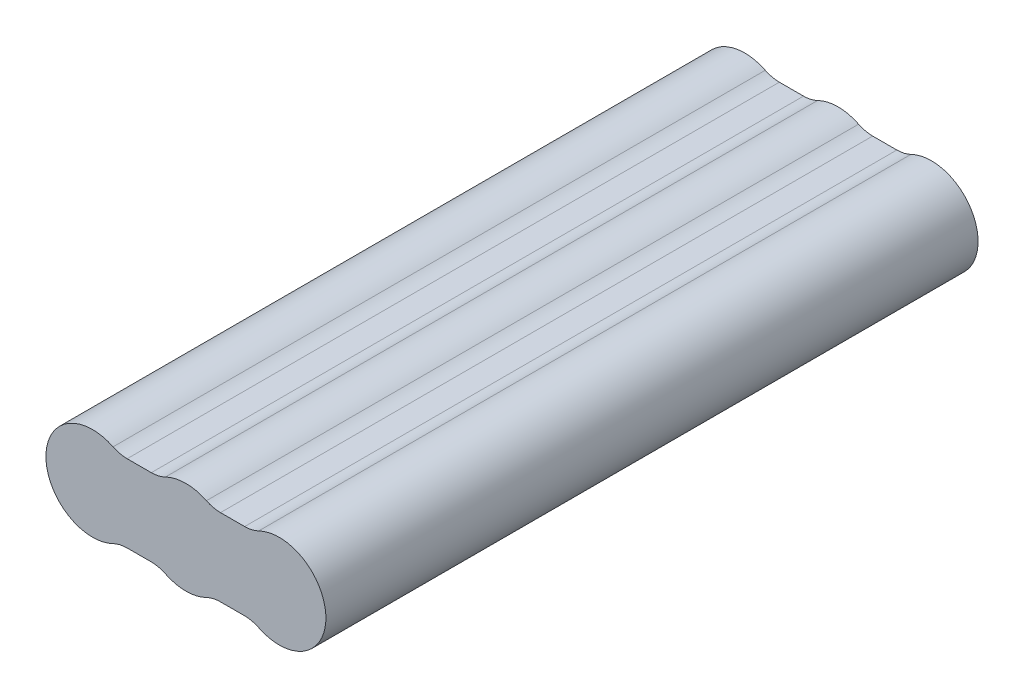
ISO-10303-21;
HEADER;
FILE_DESCRIPTION(('STEP AP214'),'2;1');
FILE_NAME('part.step','',(''),(''),'','','');
FILE_SCHEMA(('AUTOMOTIVE_DESIGN { 1 0 10303 214 1 1 1 1 }'));
ENDSEC;
DATA;
#1=APPLICATION_CONTEXT('core data for automotive mechanical design processes');
#2=APPLICATION_PROTOCOL_DEFINITION('international standard','automotive_design',2000,#1);
#3=PRODUCT_CONTEXT('',#1,'mechanical');
#4=PRODUCT('Part','Part','',(#3));
#5=PRODUCT_RELATED_PRODUCT_CATEGORY('part','',(#4));
#6=PRODUCT_DEFINITION_FORMATION('','',#4);
#7=PRODUCT_DEFINITION_CONTEXT('part definition',#1,'design');
#8=PRODUCT_DEFINITION('design','',#6,#7);
#9=PRODUCT_DEFINITION_SHAPE('','',#8);
#10=(LENGTH_UNIT() NAMED_UNIT(*) SI_UNIT(.MILLI.,.METRE.));
#11=(NAMED_UNIT(*) PLANE_ANGLE_UNIT() SI_UNIT($,.RADIAN.));
#12=(NAMED_UNIT(*) SI_UNIT($,.STERADIAN.) SOLID_ANGLE_UNIT());
#13=UNCERTAINTY_MEASURE_WITH_UNIT(LENGTH_MEASURE(1.E-05),#10,'distance_accuracy_value','');
#14=(GEOMETRIC_REPRESENTATION_CONTEXT(3) GLOBAL_UNCERTAINTY_ASSIGNED_CONTEXT((#13)) GLOBAL_UNIT_ASSIGNED_CONTEXT((#10,
#11,#12)) REPRESENTATION_CONTEXT('',''));
#15=CARTESIAN_POINT('',(0.,0.,0.));
#16=DIRECTION('',(0.,0.,1.));
#17=DIRECTION('',(1.,0.,0.));
#18=AXIS2_PLACEMENT_3D('',#15,#16,#17);
#19=CARTESIAN_POINT('',(3244.04460175756,2845.29621018992,129.3114));
#20=DIRECTION('',(0.,0.,-1.));
#21=DIRECTION('',(-1.,0.,0.));
#22=AXIS2_PLACEMENT_3D('',#19,#20,#21);
#23=CYLINDRICAL_SURFACE('',#22,6.35000000000014);
#24=CARTESIAN_POINT('',(3244.04460175756,2845.29621018992,0.));
#25=DIRECTION('',(0.,0.,-1.));
#26=DIRECTION('',(1.,0.,0.));
#27=AXIS2_PLACEMENT_3D('',#24,#25,#26);
#28=CIRCLE('',#27,6.35000000000014);
#29=CARTESIAN_POINT('',(3244.04460175756,2851.64621018992,0.));
#30=VERTEX_POINT('',#29);
#31=CARTESIAN_POINT('',(3246.83533190543,2851.00009704379,0.));
#32=VERTEX_POINT('',#31);
#33=EDGE_CURVE('E177',#30,#32,#28,.T.);
#34=ORIENTED_EDGE('',*,*,#33,.T.);
#35=DIRECTION('',(0.,0.,-1.));
#36=VECTOR('',#35,1.);
#37=CARTESIAN_POINT('',(3246.83533190543,2851.00009704379,129.3114));
#38=LINE('',#37,#36);
#39=CARTESIAN_POINT('',(3246.83533190543,2851.00009704379,129.3114));
#40=VERTEX_POINT('',#39);
#41=EDGE_CURVE('E11',#40,#32,#38,.T.);
#42=ORIENTED_EDGE('',*,*,#41,.F.);
#43=CARTESIAN_POINT('',(3244.04460175756,2845.29621018992,129.3114));
#44=DIRECTION('',(0.,0.,-1.));
#45=DIRECTION('',(1.,0.,0.));
#46=AXIS2_PLACEMENT_3D('',#43,#44,#45);
#47=CIRCLE('',#46,6.35000000000014);
#48=CARTESIAN_POINT('',(3244.04460175756,2851.64621018992,129.3114));
#49=VERTEX_POINT('',#48);
#50=EDGE_CURVE('E207',#49,#40,#47,.T.);
#51=ORIENTED_EDGE('',*,*,#50,.F.);
#52=DIRECTION('',(0.,0.,-1.));
#53=VECTOR('',#52,1.);
#54=CARTESIAN_POINT('',(3244.04460175756,2851.64621018992,129.3114));
#55=LINE('',#54,#53);
#56=EDGE_CURVE('E173',#49,#30,#55,.T.);
#57=ORIENTED_EDGE('',*,*,#56,.T.);
#58=EDGE_LOOP('',(#34,#42,#51,#57));
#59=FACE_BOUND('',#58,.T.);
#60=ADVANCED_FACE('F33',(#59),#23,.F.);
#61=CARTESIAN_POINT('',(3250.90142573087,2859.31066018989,129.3114));
#62=DIRECTION('',(0.,0.,-1.));
#63=DIRECTION('',(-1.,0.,0.));
#64=AXIS2_PLACEMENT_3D('',#61,#62,#63);
#65=CYLINDRICAL_SURFACE('',#64,9.2519500000007);
#66=CARTESIAN_POINT('',(3250.90142573087,2859.31066018989,0.));
#67=DIRECTION('',(0.,0.,1.));
#68=DIRECTION('',(1.,0.,0.));
#69=AXIS2_PLACEMENT_3D('',#66,#67,#68);
#70=CIRCLE('',#69,9.2519500000007);
#71=CARTESIAN_POINT('',(3246.83533190543,2867.62122333598,0.));
#72=VERTEX_POINT('',#71);
#73=EDGE_CURVE('E180',#32,#72,#70,.T.);
#74=ORIENTED_EDGE('',*,*,#73,.T.);
#75=DIRECTION('',(0.,0.,-1.));
#76=VECTOR('',#75,1.);
#77=CARTESIAN_POINT('',(3246.83533190543,2867.62122333598,129.3114));
#78=LINE('',#77,#76);
#79=CARTESIAN_POINT('',(3246.83533190543,2867.62122333598,129.3114));
#80=VERTEX_POINT('',#79);
#81=EDGE_CURVE('E41',#80,#72,#78,.T.);
#82=ORIENTED_EDGE('',*,*,#81,.F.);
#83=CARTESIAN_POINT('',(3250.90142573087,2859.31066018989,129.3114));
#84=DIRECTION('',(0.,0.,1.));
#85=DIRECTION('',(1.,0.,0.));
#86=AXIS2_PLACEMENT_3D('',#83,#84,#85);
#87=CIRCLE('',#86,9.2519500000007);
#88=EDGE_CURVE('E116',#40,#80,#87,.T.);
#89=ORIENTED_EDGE('',*,*,#88,.F.);
#90=ORIENTED_EDGE('',*,*,#41,.T.);
#91=EDGE_LOOP('',(#74,#82,#89,#90));
#92=FACE_BOUND('',#91,.T.);
#93=ADVANCED_FACE('F305',(#92),#65,.T.);
#94=CARTESIAN_POINT('',(3244.04460175756,2873.32511018985,129.3114));
#95=DIRECTION('',(0.,0.,-1.));
#96=DIRECTION('',(-1.,0.,0.));
#97=AXIS2_PLACEMENT_3D('',#94,#95,#96);
#98=CYLINDRICAL_SURFACE('',#97,6.35000000000034);
#99=CARTESIAN_POINT('',(3244.04460175756,2873.32511018985,0.));
#100=DIRECTION('',(0.,0.,-1.));
#101=DIRECTION('',(1.,0.,0.));
#102=AXIS2_PLACEMENT_3D('',#99,#100,#101);
#103=CIRCLE('',#102,6.35000000000034);
#104=CARTESIAN_POINT('',(3244.04460175756,2866.97511018985,0.));
#105=VERTEX_POINT('',#104);
#106=EDGE_CURVE('E182',#72,#105,#103,.T.);
#107=ORIENTED_EDGE('',*,*,#106,.T.);
#108=DIRECTION('',(0.,0.,-1.));
#109=VECTOR('',#108,1.);
#110=CARTESIAN_POINT('',(3244.04460175756,2866.97511018985,129.3114));
#111=LINE('',#110,#109);
#112=CARTESIAN_POINT('',(3244.04460175756,2866.97511018985,129.3114));
#113=VERTEX_POINT('',#112);
#114=EDGE_CURVE('E238',#113,#105,#111,.T.);
#115=ORIENTED_EDGE('',*,*,#114,.F.);
#116=CARTESIAN_POINT('',(3244.04460175756,2873.32511018985,129.3114));
#117=DIRECTION('',(0.,0.,-1.));
#118=DIRECTION('',(1.,0.,0.));
#119=AXIS2_PLACEMENT_3D('',#116,#117,#118);
#120=CIRCLE('',#119,6.35000000000034);
#121=EDGE_CURVE('E246',#80,#113,#120,.T.);
#122=ORIENTED_EDGE('',*,*,#121,.F.);
#123=ORIENTED_EDGE('',*,*,#81,.T.);
#124=EDGE_LOOP('',(#107,#115,#122,#123));
#125=FACE_BOUND('',#124,.T.);
#126=ADVANCED_FACE('F244',(#125),#98,.F.);
#127=CARTESIAN_POINT('',(3239.25434970419,2866.97511018985,129.3114));
#128=DIRECTION('',(0.,-1.,0.));
#129=DIRECTION('',(0.,0.,-1.));
#130=AXIS2_PLACEMENT_3D('',#127,#128,#129);
#131=PLANE('',#130);
#132=DIRECTION('',(-1.,0.,0.));
#133=VECTOR('',#132,1.);
#134=CARTESIAN_POINT('',(3239.25434970419,2866.97511018985,0.));
#135=LINE('',#134,#133);
#136=CARTESIAN_POINT('',(3239.25434970419,2866.97511018985,0.));
#137=VERTEX_POINT('',#136);
#138=EDGE_CURVE('E184',#105,#137,#135,.T.);
#139=ORIENTED_EDGE('',*,*,#138,.T.);
#140=DIRECTION('',(0.,0.,-1.));
#141=VECTOR('',#140,1.);
#142=CARTESIAN_POINT('',(3239.25434970419,2866.97511018985,129.3114));
#143=LINE('',#142,#141);
#144=CARTESIAN_POINT('',(3239.25434970419,2866.97511018985,129.3114));
#145=VERTEX_POINT('',#144);
#146=EDGE_CURVE('E235',#145,#137,#143,.T.);
#147=ORIENTED_EDGE('',*,*,#146,.F.);
#148=DIRECTION('',(-1.,0.,0.));
#149=VECTOR('',#148,1.);
#150=CARTESIAN_POINT('',(3239.25434970419,2866.97511018985,129.3114));
#151=LINE('',#150,#149);
#152=EDGE_CURVE('E264',#113,#145,#151,.T.);
#153=ORIENTED_EDGE('',*,*,#152,.F.);
#154=ORIENTED_EDGE('',*,*,#114,.T.);
#155=EDGE_LOOP('',(#139,#147,#153,#154));
#156=FACE_BOUND('',#155,.T.);
#157=ADVANCED_FACE('F255',(#156),#131,.F.);
#158=CARTESIAN_POINT('',(3239.25434970419,2873.32511018985,129.3114));
#159=DIRECTION('',(0.,0.,-1.));
#160=DIRECTION('',(-1.,0.,0.));
#161=AXIS2_PLACEMENT_3D('',#158,#159,#160);
#162=CYLINDRICAL_SURFACE('',#161,6.35000000000002);
#163=CARTESIAN_POINT('',(3239.25434970419,2873.32511018985,0.));
#164=DIRECTION('',(0.,0.,-1.));
#165=DIRECTION('',(1.,0.,0.));
#166=AXIS2_PLACEMENT_3D('',#163,#164,#165);
#167=CIRCLE('',#166,6.35000000000002);
#168=CARTESIAN_POINT('',(3236.46361955632,2867.62122333598,0.));
#169=VERTEX_POINT('',#168);
#170=EDGE_CURVE('E186',#137,#169,#167,.T.);
#171=ORIENTED_EDGE('',*,*,#170,.T.);
#172=DIRECTION('',(0.,0.,-1.));
#173=VECTOR('',#172,1.);
#174=CARTESIAN_POINT('',(3236.46361955632,2867.62122333598,129.3114));
#175=LINE('',#174,#173);
#176=CARTESIAN_POINT('',(3236.46361955632,2867.62122333598,129.3114));
#177=VERTEX_POINT('',#176);
#178=EDGE_CURVE('E232',#177,#169,#175,.T.);
#179=ORIENTED_EDGE('',*,*,#178,.F.);
#180=CARTESIAN_POINT('',(3239.25434970419,2873.32511018985,129.3114));
#181=DIRECTION('',(0.,0.,-1.));
#182=DIRECTION('',(1.,0.,0.));
#183=AXIS2_PLACEMENT_3D('',#180,#181,#182);
#184=CIRCLE('',#183,6.35000000000002);
#185=EDGE_CURVE('E261',#145,#177,#184,.T.);
#186=ORIENTED_EDGE('',*,*,#185,.F.);
#187=ORIENTED_EDGE('',*,*,#146,.T.);
#188=EDGE_LOOP('',(#171,#179,#186,#187));
#189=FACE_BOUND('',#188,.T.);
#190=ADVANCED_FACE('F259',(#189),#162,.F.);
#191=CARTESIAN_POINT('',(3232.39752573087,2859.31066018989,129.3114));
#192=DIRECTION('',(0.,0.,-1.));
#193=DIRECTION('',(-1.,0.,0.));
#194=AXIS2_PLACEMENT_3D('',#191,#192,#193);
#195=CYLINDRICAL_SURFACE('',#194,9.2519500000007);
#196=CARTESIAN_POINT('',(3232.39752573087,2859.31066018989,0.));
#197=DIRECTION('',(0.,0.,1.));
#198=DIRECTION('',(1.,0.,0.));
#199=AXIS2_PLACEMENT_3D('',#196,#197,#198);
#200=CIRCLE('',#199,9.2519500000007);
#201=CARTESIAN_POINT('',(3228.33143190543,2867.62122333598,0.));
#202=VERTEX_POINT('',#201);
#203=EDGE_CURVE('E188',#169,#202,#200,.T.);
#204=ORIENTED_EDGE('',*,*,#203,.T.);
#205=DIRECTION('',(0.,0.,-1.));
#206=VECTOR('',#205,1.);
#207=CARTESIAN_POINT('',(3228.33143190543,2867.62122333598,129.3114));
#208=LINE('',#207,#206);
#209=CARTESIAN_POINT('',(3228.33143190543,2867.62122333598,129.3114));
#210=VERTEX_POINT('',#209);
#211=EDGE_CURVE('E229',#210,#202,#208,.T.);
#212=ORIENTED_EDGE('',*,*,#211,.F.);
#213=CARTESIAN_POINT('',(3232.39752573087,2859.31066018989,129.3114));
#214=DIRECTION('',(0.,0.,1.));
#215=DIRECTION('',(1.,0.,0.));
#216=AXIS2_PLACEMENT_3D('',#213,#214,#215);
#217=CIRCLE('',#216,9.2519500000007);
#218=EDGE_CURVE('E263',#177,#210,#217,.T.);
#219=ORIENTED_EDGE('',*,*,#218,.F.);
#220=ORIENTED_EDGE('',*,*,#178,.T.);
#221=EDGE_LOOP('',(#204,#212,#219,#220));
#222=FACE_BOUND('',#221,.T.);
#223=ADVANCED_FACE('F318',(#222),#195,.T.);
#224=CARTESIAN_POINT('',(3225.54070175756,2873.32511018985,129.3114));
#225=DIRECTION('',(0.,0.,-1.));
#226=DIRECTION('',(-1.,0.,0.));
#227=AXIS2_PLACEMENT_3D('',#224,#225,#226);
#228=CYLINDRICAL_SURFACE('',#227,6.35000000000034);
#229=CARTESIAN_POINT('',(3225.54070175756,2873.32511018985,0.));
#230=DIRECTION('',(0.,0.,-1.));
#231=DIRECTION('',(1.,0.,0.));
#232=AXIS2_PLACEMENT_3D('',#229,#230,#231);
#233=CIRCLE('',#232,6.35000000000034);
#234=CARTESIAN_POINT('',(3225.54070175756,2866.97511018985,0.));
#235=VERTEX_POINT('',#234);
#236=EDGE_CURVE('E190',#202,#235,#233,.T.);
#237=ORIENTED_EDGE('',*,*,#236,.T.);
#238=DIRECTION('',(0.,0.,-1.));
#239=VECTOR('',#238,1.);
#240=CARTESIAN_POINT('',(3225.54070175756,2866.97511018985,129.3114));
#241=LINE('',#240,#239);
#242=CARTESIAN_POINT('',(3225.54070175756,2866.97511018985,129.3114));
#243=VERTEX_POINT('',#242);
#244=EDGE_CURVE('E226',#243,#235,#241,.T.);
#245=ORIENTED_EDGE('',*,*,#244,.F.);
#246=CARTESIAN_POINT('',(3225.54070175756,2873.32511018985,129.3114));
#247=DIRECTION('',(0.,0.,-1.));
#248=DIRECTION('',(1.,0.,0.));
#249=AXIS2_PLACEMENT_3D('',#246,#247,#248);
#250=CIRCLE('',#249,6.35000000000034);
#251=EDGE_CURVE('E266',#210,#243,#250,.T.);
#252=ORIENTED_EDGE('',*,*,#251,.F.);
#253=ORIENTED_EDGE('',*,*,#211,.T.);
#254=EDGE_LOOP('',(#237,#245,#252,#253));
#255=FACE_BOUND('',#254,.T.);
#256=ADVANCED_FACE('F321',(#255),#228,.F.);
#257=CARTESIAN_POINT('',(3220.75044970419,2866.97511018985,129.3114));
#258=DIRECTION('',(0.,-1.,0.));
#259=DIRECTION('',(0.,0.,-1.));
#260=AXIS2_PLACEMENT_3D('',#257,#258,#259);
#261=PLANE('',#260);
#262=DIRECTION('',(-1.,0.,0.));
#263=VECTOR('',#262,1.);
#264=CARTESIAN_POINT('',(3220.75044970419,2866.97511018985,0.));
#265=LINE('',#264,#263);
#266=CARTESIAN_POINT('',(3220.75044970419,2866.97511018985,0.));
#267=VERTEX_POINT('',#266);
#268=EDGE_CURVE('E192',#235,#267,#265,.T.);
#269=ORIENTED_EDGE('',*,*,#268,.T.);
#270=DIRECTION('',(0.,0.,-1.));
#271=VECTOR('',#270,1.);
#272=CARTESIAN_POINT('',(3220.75044970419,2866.97511018985,129.3114));
#273=LINE('',#272,#271);
#274=CARTESIAN_POINT('',(3220.75044970419,2866.97511018985,129.3114));
#275=VERTEX_POINT('',#274);
#276=EDGE_CURVE('E223',#275,#267,#273,.T.);
#277=ORIENTED_EDGE('',*,*,#276,.F.);
#278=DIRECTION('',(-1.,0.,0.));
#279=VECTOR('',#278,1.);
#280=CARTESIAN_POINT('',(3220.75044970419,2866.97511018985,129.3114));
#281=LINE('',#280,#279);
#282=EDGE_CURVE('E272',#243,#275,#281,.T.);
#283=ORIENTED_EDGE('',*,*,#282,.F.);
#284=ORIENTED_EDGE('',*,*,#244,.T.);
#285=EDGE_LOOP('',(#269,#277,#283,#284));
#286=FACE_BOUND('',#285,.T.);
#287=ADVANCED_FACE('F325',(#286),#261,.F.);
#288=CARTESIAN_POINT('',(3220.75044970419,2873.32511018985,129.3114));
#289=DIRECTION('',(0.,0.,-1.));
#290=DIRECTION('',(-1.,0.,0.));
#291=AXIS2_PLACEMENT_3D('',#288,#289,#290);
#292=CYLINDRICAL_SURFACE('',#291,6.35000000000002);
#293=CARTESIAN_POINT('',(3220.75044970419,2873.32511018985,0.));
#294=DIRECTION('',(0.,0.,-1.));
#295=DIRECTION('',(1.,0.,0.));
#296=AXIS2_PLACEMENT_3D('',#293,#294,#295);
#297=CIRCLE('',#296,6.35000000000002);
#298=CARTESIAN_POINT('',(3217.95971955632,2867.62122333598,0.));
#299=VERTEX_POINT('',#298);
#300=EDGE_CURVE('E194',#267,#299,#297,.T.);
#301=ORIENTED_EDGE('',*,*,#300,.T.);
#302=DIRECTION('',(0.,0.,-1.));
#303=VECTOR('',#302,1.);
#304=CARTESIAN_POINT('',(3217.95971955632,2867.62122333598,129.3114));
#305=LINE('',#304,#303);
#306=CARTESIAN_POINT('',(3217.95971955632,2867.62122333598,129.3114));
#307=VERTEX_POINT('',#306);
#308=EDGE_CURVE('E220',#307,#299,#305,.T.);
#309=ORIENTED_EDGE('',*,*,#308,.F.);
#310=CARTESIAN_POINT('',(3220.75044970419,2873.32511018985,129.3114));
#311=DIRECTION('',(0.,0.,-1.));
#312=DIRECTION('',(1.,0.,0.));
#313=AXIS2_PLACEMENT_3D('',#310,#311,#312);
#314=CIRCLE('',#313,6.35000000000002);
#315=EDGE_CURVE('E274',#275,#307,#314,.T.);
#316=ORIENTED_EDGE('',*,*,#315,.F.);
#317=ORIENTED_EDGE('',*,*,#276,.T.);
#318=EDGE_LOOP('',(#301,#309,#316,#317));
#319=FACE_BOUND('',#318,.T.);
#320=ADVANCED_FACE('F329',(#319),#292,.F.);
#321=CARTESIAN_POINT('',(3213.89362573087,2859.31066018989,129.3114));
#322=DIRECTION('',(0.,0.,-1.));
#323=DIRECTION('',(-1.,0.,0.));
#324=AXIS2_PLACEMENT_3D('',#321,#322,#323);
#325=CYLINDRICAL_SURFACE('',#324,9.2519500000003);
#326=CARTESIAN_POINT('',(3213.89362573087,2859.31066018989,0.));
#327=DIRECTION('',(0.,0.,1.));
#328=DIRECTION('',(1.,0.,0.));
#329=AXIS2_PLACEMENT_3D('',#326,#327,#328);
#330=CIRCLE('',#329,9.2519500000003);
#331=CARTESIAN_POINT('',(3217.95971955632,2851.00009704379,0.));
#332=VERTEX_POINT('',#331);
#333=EDGE_CURVE('E196',#299,#332,#330,.T.);
#334=ORIENTED_EDGE('',*,*,#333,.T.);
#335=DIRECTION('',(0.,0.,-1.));
#336=VECTOR('',#335,1.);
#337=CARTESIAN_POINT('',(3217.95971955632,2851.00009704379,129.3114));
#338=LINE('',#337,#336);
#339=CARTESIAN_POINT('',(3217.95971955632,2851.00009704379,129.3114));
#340=VERTEX_POINT('',#339);
#341=EDGE_CURVE('E217',#340,#332,#338,.T.);
#342=ORIENTED_EDGE('',*,*,#341,.F.);
#343=CARTESIAN_POINT('',(3213.89362573087,2859.31066018989,129.3114));
#344=DIRECTION('',(0.,0.,1.));
#345=DIRECTION('',(1.,0.,0.));
#346=AXIS2_PLACEMENT_3D('',#343,#344,#345);
#347=CIRCLE('',#346,9.2519500000003);
#348=EDGE_CURVE('E276',#307,#340,#347,.T.);
#349=ORIENTED_EDGE('',*,*,#348,.F.);
#350=ORIENTED_EDGE('',*,*,#308,.T.);
#351=EDGE_LOOP('',(#334,#342,#349,#350));
#352=FACE_BOUND('',#351,.T.);
#353=ADVANCED_FACE('F333',(#352),#325,.T.);
#354=CARTESIAN_POINT('',(3220.75044970419,2845.29621018992,129.3114));
#355=DIRECTION('',(0.,0.,-1.));
#356=DIRECTION('',(-1.,0.,0.));
#357=AXIS2_PLACEMENT_3D('',#354,#355,#356);
#358=CYLINDRICAL_SURFACE('',#357,6.35000000000002);
#359=CARTESIAN_POINT('',(3220.75044970419,2845.29621018992,0.));
#360=DIRECTION('',(0.,0.,-1.));
#361=DIRECTION('',(1.,0.,0.));
#362=AXIS2_PLACEMENT_3D('',#359,#360,#361);
#363=CIRCLE('',#362,6.35000000000002);
#364=CARTESIAN_POINT('',(3220.75044970419,2851.64621018992,0.));
#365=VERTEX_POINT('',#364);
#366=EDGE_CURVE('E198',#332,#365,#363,.T.);
#367=ORIENTED_EDGE('',*,*,#366,.T.);
#368=DIRECTION('',(0.,0.,-1.));
#369=VECTOR('',#368,1.);
#370=CARTESIAN_POINT('',(3220.75044970419,2851.64621018992,129.3114));
#371=LINE('',#370,#369);
#372=CARTESIAN_POINT('',(3220.75044970419,2851.64621018992,129.3114));
#373=VERTEX_POINT('',#372);
#374=EDGE_CURVE('E214',#373,#365,#371,.T.);
#375=ORIENTED_EDGE('',*,*,#374,.F.);
#376=CARTESIAN_POINT('',(3220.75044970419,2845.29621018992,129.3114));
#377=DIRECTION('',(0.,0.,-1.));
#378=DIRECTION('',(1.,0.,0.));
#379=AXIS2_PLACEMENT_3D('',#376,#377,#378);
#380=CIRCLE('',#379,6.35000000000002);
#381=EDGE_CURVE('E278',#340,#373,#380,.T.);
#382=ORIENTED_EDGE('',*,*,#381,.F.);
#383=ORIENTED_EDGE('',*,*,#341,.T.);
#384=EDGE_LOOP('',(#367,#375,#382,#383));
#385=FACE_BOUND('',#384,.T.);
#386=ADVANCED_FACE('F337',(#385),#358,.F.);
#387=CARTESIAN_POINT('',(3220.75044970419,2851.64621018992,129.3114));
#388=DIRECTION('',(0.,1.,0.));
#389=DIRECTION('',(0.,0.,1.));
#390=AXIS2_PLACEMENT_3D('',#387,#388,#389);
#391=PLANE('',#390);
#392=DIRECTION('',(1.,0.,0.));
#393=VECTOR('',#392,1.);
#394=CARTESIAN_POINT('',(3220.75044970419,2851.64621018992,0.));
#395=LINE('',#394,#393);
#396=CARTESIAN_POINT('',(3225.54070175756,2851.64621018992,0.));
#397=VERTEX_POINT('',#396);
#398=EDGE_CURVE('E200',#365,#397,#395,.T.);
#399=ORIENTED_EDGE('',*,*,#398,.T.);
#400=DIRECTION('',(0.,0.,-1.));
#401=VECTOR('',#400,1.);
#402=CARTESIAN_POINT('',(3225.54070175756,2851.64621018992,129.3114));
#403=LINE('',#402,#401);
#404=CARTESIAN_POINT('',(3225.54070175756,2851.64621018992,129.3114));
#405=VERTEX_POINT('',#404);
#406=EDGE_CURVE('E211',#405,#397,#403,.T.);
#407=ORIENTED_EDGE('',*,*,#406,.F.);
#408=DIRECTION('',(1.,0.,0.));
#409=VECTOR('',#408,1.);
#410=CARTESIAN_POINT('',(3220.75044970419,2851.64621018992,129.3114));
#411=LINE('',#410,#409);
#412=EDGE_CURVE('E280',#373,#405,#411,.T.);
#413=ORIENTED_EDGE('',*,*,#412,.F.);
#414=ORIENTED_EDGE('',*,*,#374,.T.);
#415=EDGE_LOOP('',(#399,#407,#413,#414));
#416=FACE_BOUND('',#415,.T.);
#417=ADVANCED_FACE('F286',(#416),#391,.F.);
#418=CARTESIAN_POINT('',(3225.54070175756,2845.29621018992,129.3114));
#419=DIRECTION('',(0.,0.,-1.));
#420=DIRECTION('',(-1.,0.,0.));
#421=AXIS2_PLACEMENT_3D('',#418,#419,#420);
#422=CYLINDRICAL_SURFACE('',#421,6.35000000000024);
#423=CARTESIAN_POINT('',(3225.54070175756,2845.29621018992,0.));
#424=DIRECTION('',(0.,0.,-1.));
#425=DIRECTION('',(1.,0.,0.));
#426=AXIS2_PLACEMENT_3D('',#423,#424,#425);
#427=CIRCLE('',#426,6.35000000000024);
#428=CARTESIAN_POINT('',(3228.33143190543,2851.00009704379,0.));
#429=VERTEX_POINT('',#428);
#430=EDGE_CURVE('E202',#397,#429,#427,.T.);
#431=ORIENTED_EDGE('',*,*,#430,.T.);
#432=DIRECTION('',(0.,0.,-1.));
#433=VECTOR('',#432,1.);
#434=CARTESIAN_POINT('',(3228.33143190543,2851.00009704379,129.3114));
#435=LINE('',#434,#433);
#436=CARTESIAN_POINT('',(3228.33143190543,2851.00009704379,129.3114));
#437=VERTEX_POINT('',#436);
#438=EDGE_CURVE('E168',#437,#429,#435,.T.);
#439=ORIENTED_EDGE('',*,*,#438,.F.);
#440=CARTESIAN_POINT('',(3225.54070175756,2845.29621018992,129.3114));
#441=DIRECTION('',(0.,0.,-1.));
#442=DIRECTION('',(1.,0.,0.));
#443=AXIS2_PLACEMENT_3D('',#440,#441,#442);
#444=CIRCLE('',#443,6.35000000000024);
#445=EDGE_CURVE('E159',#405,#437,#444,.T.);
#446=ORIENTED_EDGE('',*,*,#445,.F.);
#447=ORIENTED_EDGE('',*,*,#406,.T.);
#448=EDGE_LOOP('',(#431,#439,#446,#447));
#449=FACE_BOUND('',#448,.T.);
#450=ADVANCED_FACE('F290',(#449),#422,.F.);
#451=CARTESIAN_POINT('',(3232.39752573087,2859.31066018989,129.3114));
#452=DIRECTION('',(0.,0.,-1.));
#453=DIRECTION('',(-1.,0.,0.));
#454=AXIS2_PLACEMENT_3D('',#451,#452,#453);
#455=CYLINDRICAL_SURFACE('',#454,9.2519500000003);
#456=CARTESIAN_POINT('',(3232.39752573087,2859.31066018989,0.));
#457=DIRECTION('',(0.,0.,1.));
#458=DIRECTION('',(1.,0.,0.));
#459=AXIS2_PLACEMENT_3D('',#456,#457,#458);
#460=CIRCLE('',#459,9.2519500000003);
#461=CARTESIAN_POINT('',(3236.46361955632,2851.00009704379,0.));
#462=VERTEX_POINT('',#461);
#463=EDGE_CURVE('E167',#429,#462,#460,.T.);
#464=ORIENTED_EDGE('',*,*,#463,.T.);
#465=DIRECTION('',(0.,0.,-1.));
#466=VECTOR('',#465,1.);
#467=CARTESIAN_POINT('',(3236.46361955632,2851.00009704379,129.3114));
#468=LINE('',#467,#466);
#469=CARTESIAN_POINT('',(3236.46361955632,2851.00009704379,129.3114));
#470=VERTEX_POINT('',#469);
#471=EDGE_CURVE('E164',#470,#462,#468,.T.);
#472=ORIENTED_EDGE('',*,*,#471,.F.);
#473=CARTESIAN_POINT('',(3232.39752573087,2859.31066018989,129.3114));
#474=DIRECTION('',(0.,0.,1.));
#475=DIRECTION('',(1.,0.,0.));
#476=AXIS2_PLACEMENT_3D('',#473,#474,#475);
#477=CIRCLE('',#476,9.2519500000003);
#478=EDGE_CURVE('E153',#437,#470,#477,.T.);
#479=ORIENTED_EDGE('',*,*,#478,.F.);
#480=ORIENTED_EDGE('',*,*,#438,.T.);
#481=EDGE_LOOP('',(#464,#472,#479,#480));
#482=FACE_BOUND('',#481,.T.);
#483=ADVANCED_FACE('F165',(#482),#455,.T.);
#484=CARTESIAN_POINT('',(3239.25434970419,2845.29621018992,129.3114));
#485=DIRECTION('',(0.,0.,-1.));
#486=DIRECTION('',(-1.,0.,0.));
#487=AXIS2_PLACEMENT_3D('',#484,#485,#486);
#488=CYLINDRICAL_SURFACE('',#487,6.35000000000002);
#489=CARTESIAN_POINT('',(3239.25434970419,2845.29621018992,0.));
#490=DIRECTION('',(0.,0.,-1.));
#491=DIRECTION('',(1.,0.,0.));
#492=AXIS2_PLACEMENT_3D('',#489,#490,#491);
#493=CIRCLE('',#492,6.35000000000002);
#494=CARTESIAN_POINT('',(3239.25434970419,2851.64621018992,0.));
#495=VERTEX_POINT('',#494);
#496=EDGE_CURVE('E102',#462,#495,#493,.T.);
#497=ORIENTED_EDGE('',*,*,#496,.T.);
#498=DIRECTION('',(0.,0.,-1.));
#499=VECTOR('',#498,1.);
#500=CARTESIAN_POINT('',(3239.25434970419,2851.64621018992,129.3114));
#501=LINE('',#500,#499);
#502=CARTESIAN_POINT('',(3239.25434970419,2851.64621018992,129.3114));
#503=VERTEX_POINT('',#502);
#504=EDGE_CURVE('E169',#503,#495,#501,.T.);
#505=ORIENTED_EDGE('',*,*,#504,.F.);
#506=CARTESIAN_POINT('',(3239.25434970419,2845.29621018992,129.3114));
#507=DIRECTION('',(0.,0.,-1.));
#508=DIRECTION('',(1.,0.,0.));
#509=AXIS2_PLACEMENT_3D('',#506,#507,#508);
#510=CIRCLE('',#509,6.35000000000002);
#511=EDGE_CURVE('E157',#470,#503,#510,.T.);
#512=ORIENTED_EDGE('',*,*,#511,.F.);
#513=ORIENTED_EDGE('',*,*,#471,.T.);
#514=EDGE_LOOP('',(#497,#505,#512,#513));
#515=FACE_BOUND('',#514,.T.);
#516=ADVANCED_FACE('F171',(#515),#488,.F.);
#517=CARTESIAN_POINT('',(3239.25434970419,2851.64621018992,129.3114));
#518=DIRECTION('',(0.,1.,0.));
#519=DIRECTION('',(0.,0.,1.));
#520=AXIS2_PLACEMENT_3D('',#517,#518,#519);
#521=PLANE('',#520);
#522=DIRECTION('',(1.,0.,0.));
#523=VECTOR('',#522,1.);
#524=CARTESIAN_POINT('',(3239.25434970419,2851.64621018992,0.));
#525=LINE('',#524,#523);
#526=EDGE_CURVE('E108',#495,#30,#525,.T.);
#527=ORIENTED_EDGE('',*,*,#526,.T.);
#528=ORIENTED_EDGE('',*,*,#56,.F.);
#529=DIRECTION('',(1.,0.,0.));
#530=VECTOR('',#529,1.);
#531=CARTESIAN_POINT('',(3239.25434970419,2851.64621018992,129.3114));
#532=LINE('',#531,#530);
#533=EDGE_CURVE('E49',#503,#49,#532,.T.);
#534=ORIENTED_EDGE('',*,*,#533,.F.);
#535=ORIENTED_EDGE('',*,*,#504,.T.);
#536=EDGE_LOOP('',(#527,#528,#534,#535));
#537=FACE_BOUND('',#536,.T.);
#538=ADVANCED_FACE('F294',(#537),#521,.F.);
#539=CARTESIAN_POINT('',(3244.04460175756,2845.29621018992,129.3114));
#540=DIRECTION('',(0.,0.,1.));
#541=DIRECTION('',(1.,0.,0.));
#542=AXIS2_PLACEMENT_3D('',#539,#540,#541);
#543=PLANE('',#542);
#544=ORIENTED_EDGE('',*,*,#50,.T.);
#545=ORIENTED_EDGE('',*,*,#88,.T.);
#546=ORIENTED_EDGE('',*,*,#121,.T.);
#547=ORIENTED_EDGE('',*,*,#152,.T.);
#548=ORIENTED_EDGE('',*,*,#185,.T.);
#549=ORIENTED_EDGE('',*,*,#218,.T.);
#550=ORIENTED_EDGE('',*,*,#251,.T.);
#551=ORIENTED_EDGE('',*,*,#282,.T.);
#552=ORIENTED_EDGE('',*,*,#315,.T.);
#553=ORIENTED_EDGE('',*,*,#348,.T.);
#554=ORIENTED_EDGE('',*,*,#381,.T.);
#555=ORIENTED_EDGE('',*,*,#412,.T.);
#556=ORIENTED_EDGE('',*,*,#445,.T.);
#557=ORIENTED_EDGE('',*,*,#478,.T.);
#558=ORIENTED_EDGE('',*,*,#511,.T.);
#559=ORIENTED_EDGE('',*,*,#533,.T.);
#560=EDGE_LOOP('',(#544,#545,#546,#547,#548,#549,#550,#551,#552,#553,#554,#555,#556,#557,#558,#559));
#561=FACE_BOUND('',#560,.T.);
#562=ADVANCED_FACE('F155',(#561),#543,.T.);
#563=CARTESIAN_POINT('',(3244.04460175756,2845.29621018992,0.));
#564=DIRECTION('',(0.,0.,1.));
#565=DIRECTION('',(1.,0.,0.));
#566=AXIS2_PLACEMENT_3D('',#563,#564,#565);
#567=PLANE('',#566);
#568=ORIENTED_EDGE('',*,*,#33,.F.);
#569=ORIENTED_EDGE('',*,*,#526,.F.);
#570=ORIENTED_EDGE('',*,*,#496,.F.);
#571=ORIENTED_EDGE('',*,*,#463,.F.);
#572=ORIENTED_EDGE('',*,*,#430,.F.);
#573=ORIENTED_EDGE('',*,*,#398,.F.);
#574=ORIENTED_EDGE('',*,*,#366,.F.);
#575=ORIENTED_EDGE('',*,*,#333,.F.);
#576=ORIENTED_EDGE('',*,*,#300,.F.);
#577=ORIENTED_EDGE('',*,*,#268,.F.);
#578=ORIENTED_EDGE('',*,*,#236,.F.);
#579=ORIENTED_EDGE('',*,*,#203,.F.);
#580=ORIENTED_EDGE('',*,*,#170,.F.);
#581=ORIENTED_EDGE('',*,*,#138,.F.);
#582=ORIENTED_EDGE('',*,*,#106,.F.);
#583=ORIENTED_EDGE('',*,*,#73,.F.);
#584=EDGE_LOOP('',(#568,#569,#570,#571,#572,#573,#574,#575,#576,#577,#578,#579,#580,#581,#582,#583));
#585=FACE_BOUND('',#584,.T.);
#586=ADVANCED_FACE('F250',(#585),#567,.F.);
#587=CLOSED_SHELL('',(#60,#93,#126,#157,#190,#223,#256,#287,#320,#353,#386,#417,#450,#483,#516,
#538,#562,#586));
#588=MANIFOLD_SOLID_BREP('B2',#587);
#589=ADVANCED_BREP_SHAPE_REPRESENTATION('',(#18,#588),#14);
#590=SHAPE_DEFINITION_REPRESENTATION(#9,#589);
ENDSEC;
END-ISO-10303-21;
